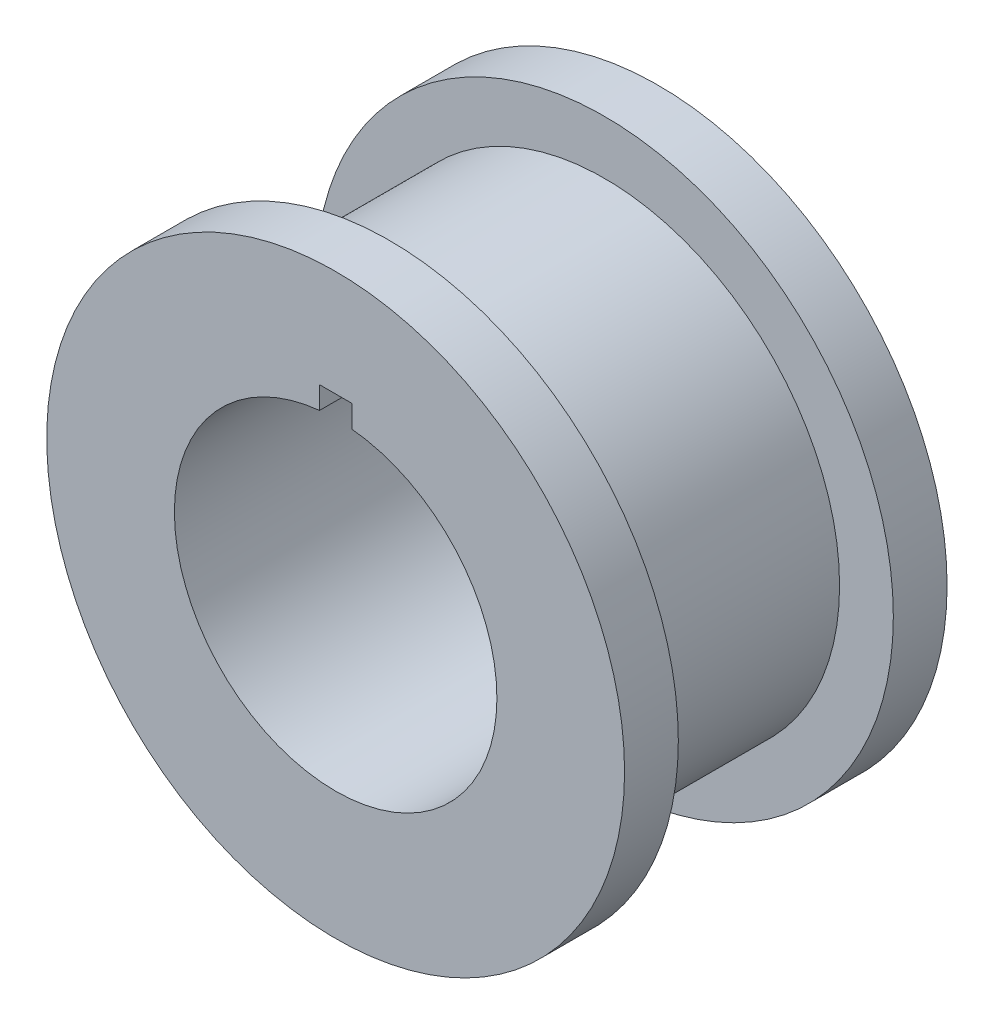
ISO-10303-21;
HEADER;
FILE_DESCRIPTION(('STEP AP214'),'2;1');
FILE_NAME('part.step','',(''),(''),'','','');
FILE_SCHEMA(('AUTOMOTIVE_DESIGN { 1 0 10303 214 1 1 1 1 }'));
ENDSEC;
DATA;
#1=APPLICATION_CONTEXT('core data for automotive mechanical design processes');
#2=APPLICATION_PROTOCOL_DEFINITION('international standard','automotive_design',2000,#1);
#3=PRODUCT_CONTEXT('',#1,'mechanical');
#4=PRODUCT('Part','Part','',(#3));
#5=PRODUCT_RELATED_PRODUCT_CATEGORY('part','',(#4));
#6=PRODUCT_DEFINITION_FORMATION('','',#4);
#7=PRODUCT_DEFINITION_CONTEXT('part definition',#1,'design');
#8=PRODUCT_DEFINITION('design','',#6,#7);
#9=PRODUCT_DEFINITION_SHAPE('','',#8);
#10=(LENGTH_UNIT() NAMED_UNIT(*) SI_UNIT(.MILLI.,.METRE.));
#11=(NAMED_UNIT(*) PLANE_ANGLE_UNIT() SI_UNIT($,.RADIAN.));
#12=(NAMED_UNIT(*) SI_UNIT($,.STERADIAN.) SOLID_ANGLE_UNIT());
#13=UNCERTAINTY_MEASURE_WITH_UNIT(LENGTH_MEASURE(1.E-05),#10,'distance_accuracy_value','');
#14=(GEOMETRIC_REPRESENTATION_CONTEXT(3) GLOBAL_UNCERTAINTY_ASSIGNED_CONTEXT((#13)) GLOBAL_UNIT_ASSIGNED_CONTEXT((#10,
#11,#12)) REPRESENTATION_CONTEXT('',''));
#15=CARTESIAN_POINT('',(0.,0.,0.));
#16=DIRECTION('',(0.,0.,1.));
#17=DIRECTION('',(1.,0.,0.));
#18=AXIS2_PLACEMENT_3D('',#15,#16,#17);
#19=CARTESIAN_POINT('',(0.,0.,15.));
#20=DIRECTION('',(0.,0.,-1.));
#21=DIRECTION('',(-1.,0.,0.));
#22=AXIS2_PLACEMENT_3D('',#19,#20,#21);
#23=CYLINDRICAL_SURFACE('',#22,21.875);
#24=CARTESIAN_POINT('',(0.,0.,10.));
#25=DIRECTION('',(0.,0.,1.));
#26=DIRECTION('',(1.,0.,0.));
#27=AXIS2_PLACEMENT_3D('',#24,#25,#26);
#28=CIRCLE('',#27,21.875);
#29=CARTESIAN_POINT('',(21.875,0.,10.));
#30=VERTEX_POINT('',#29);
#31=EDGE_CURVE('E50',#30,#30,#28,.T.);
#32=ORIENTED_EDGE('',*,*,#31,.F.);
#33=EDGE_LOOP('',(#32));
#34=FACE_BOUND('',#33,.T.);
#35=CARTESIAN_POINT('',(0.,0.,-10.));
#36=DIRECTION('',(0.,0.,-1.));
#37=DIRECTION('',(-1.,0.,0.));
#38=AXIS2_PLACEMENT_3D('',#35,#36,#37);
#39=CIRCLE('',#38,21.875);
#40=CARTESIAN_POINT('',(-21.875,0.,-10.));
#41=VERTEX_POINT('',#40);
#42=EDGE_CURVE('E11',#41,#41,#39,.T.);
#43=ORIENTED_EDGE('',*,*,#42,.F.);
#44=EDGE_LOOP('',(#43));
#45=FACE_BOUND('',#44,.T.);
#46=ADVANCED_FACE('F43',(#34,#45),#23,.T.);
#47=CARTESIAN_POINT('',(0.,0.,15.));
#48=DIRECTION('',(0.,0.,1.));
#49=DIRECTION('',(1.,0.,0.));
#50=AXIS2_PLACEMENT_3D('',#47,#48,#49);
#51=PLANE('',#50);
#52=CARTESIAN_POINT('',(0.,0.,15.));
#53=DIRECTION('',(0.,0.,1.));
#54=DIRECTION('',(1.,0.,0.));
#55=AXIS2_PLACEMENT_3D('',#52,#53,#54);
#56=CIRCLE('',#55,15.);
#57=CARTESIAN_POINT('',(-1.5,14.9248115565993,15.));
#58=VERTEX_POINT('',#57);
#59=CARTESIAN_POINT('',(1.49999999999999,14.9248115565993,15.));
#60=VERTEX_POINT('',#59);
#61=EDGE_CURVE('E85',#58,#60,#56,.T.);
#62=ORIENTED_EDGE('',*,*,#61,.F.);
#63=DIRECTION('',(0.,-1.,0.));
#64=VECTOR('',#63,1.);
#65=CARTESIAN_POINT('',(-1.5,0.,15.));
#66=LINE('',#65,#64);
#67=CARTESIAN_POINT('',(-1.5,17.,15.));
#68=VERTEX_POINT('',#67);
#69=EDGE_CURVE('E95',#68,#58,#66,.T.);
#70=ORIENTED_EDGE('',*,*,#69,.F.);
#71=DIRECTION('',(-1.,0.,0.));
#72=VECTOR('',#71,1.);
#73=CARTESIAN_POINT('',(-1.5,17.,15.));
#74=LINE('',#73,#72);
#75=CARTESIAN_POINT('',(1.49999999999999,17.,15.));
#76=VERTEX_POINT('',#75);
#77=EDGE_CURVE('E110',#76,#68,#74,.T.);
#78=ORIENTED_EDGE('',*,*,#77,.F.);
#79=DIRECTION('',(0.,1.,0.));
#80=VECTOR('',#79,1.);
#81=CARTESIAN_POINT('',(1.5,0.,15.));
#82=LINE('',#81,#80);
#83=EDGE_CURVE('E82',#60,#76,#82,.T.);
#84=ORIENTED_EDGE('',*,*,#83,.F.);
#85=EDGE_LOOP('',(#62,#70,#78,#84));
#86=FACE_BOUND('',#85,.T.);
#87=CARTESIAN_POINT('',(0.,0.,15.));
#88=DIRECTION('',(0.,0.,1.));
#89=DIRECTION('',(1.,0.,0.));
#90=AXIS2_PLACEMENT_3D('',#87,#88,#89);
#91=CIRCLE('',#90,26.875);
#92=CARTESIAN_POINT('',(26.875,0.,15.));
#93=VERTEX_POINT('',#92);
#94=EDGE_CURVE('E237',#93,#93,#91,.T.);
#95=ORIENTED_EDGE('',*,*,#94,.T.);
#96=EDGE_LOOP('',(#95));
#97=FACE_BOUND('',#96,.T.);
#98=ADVANCED_FACE('F126',(#86,#97),#51,.T.);
#99=CARTESIAN_POINT('',(0.,0.,-15.));
#100=DIRECTION('',(0.,0.,1.));
#101=DIRECTION('',(1.,0.,0.));
#102=AXIS2_PLACEMENT_3D('',#99,#100,#101);
#103=PLANE('',#102);
#104=DIRECTION('',(0.,-1.,0.));
#105=VECTOR('',#104,1.);
#106=CARTESIAN_POINT('',(-1.5,0.,-15.));
#107=LINE('',#106,#105);
#108=CARTESIAN_POINT('',(-1.5,17.,-15.));
#109=VERTEX_POINT('',#108);
#110=CARTESIAN_POINT('',(-1.5,14.9248115565993,-15.));
#111=VERTEX_POINT('',#110);
#112=EDGE_CURVE('E102',#109,#111,#107,.T.);
#113=ORIENTED_EDGE('',*,*,#112,.T.);
#114=CARTESIAN_POINT('',(0.,0.,-15.));
#115=DIRECTION('',(0.,0.,1.));
#116=DIRECTION('',(1.,0.,0.));
#117=AXIS2_PLACEMENT_3D('',#114,#115,#116);
#118=CIRCLE('',#117,15.);
#119=CARTESIAN_POINT('',(1.49999999999999,14.9248115565993,-15.));
#120=VERTEX_POINT('',#119);
#121=EDGE_CURVE('E101',#111,#120,#118,.T.);
#122=ORIENTED_EDGE('',*,*,#121,.T.);
#123=DIRECTION('',(0.,1.,0.));
#124=VECTOR('',#123,1.);
#125=CARTESIAN_POINT('',(1.5,0.,-15.));
#126=LINE('',#125,#124);
#127=CARTESIAN_POINT('',(1.49999999999999,17.,-15.));
#128=VERTEX_POINT('',#127);
#129=EDGE_CURVE('E57',#120,#128,#126,.T.);
#130=ORIENTED_EDGE('',*,*,#129,.T.);
#131=DIRECTION('',(-1.,0.,0.));
#132=VECTOR('',#131,1.);
#133=CARTESIAN_POINT('',(-1.5,17.,-15.));
#134=LINE('',#133,#132);
#135=EDGE_CURVE('E89',#128,#109,#134,.T.);
#136=ORIENTED_EDGE('',*,*,#135,.T.);
#137=EDGE_LOOP('',(#113,#122,#130,#136));
#138=FACE_BOUND('',#137,.T.);
#139=CARTESIAN_POINT('',(0.,0.,-15.));
#140=DIRECTION('',(0.,0.,1.));
#141=DIRECTION('',(1.,0.,0.));
#142=AXIS2_PLACEMENT_3D('',#139,#140,#141);
#143=CIRCLE('',#142,26.875);
#144=CARTESIAN_POINT('',(26.875,0.,-15.));
#145=VERTEX_POINT('',#144);
#146=EDGE_CURVE('E242',#145,#145,#143,.T.);
#147=ORIENTED_EDGE('',*,*,#146,.F.);
#148=EDGE_LOOP('',(#147));
#149=FACE_BOUND('',#148,.T.);
#150=ADVANCED_FACE('F98',(#138,#149),#103,.F.);
#151=CARTESIAN_POINT('',(0.,0.,-15.));
#152=DIRECTION('',(0.,0.,1.));
#153=DIRECTION('',(1.,0.,0.));
#154=AXIS2_PLACEMENT_3D('',#151,#152,#153);
#155=CYLINDRICAL_SURFACE('',#154,15.);
#156=DIRECTION('',(0.,0.,1.));
#157=VECTOR('',#156,1.);
#158=CARTESIAN_POINT('',(-1.5,14.9248115565993,-15.));
#159=LINE('',#158,#157);
#160=EDGE_CURVE('E117',#58,#111,#159,.F.);
#161=ORIENTED_EDGE('',*,*,#160,.F.);
#162=ORIENTED_EDGE('',*,*,#61,.T.);
#163=DIRECTION('',(0.,0.,1.));
#164=VECTOR('',#163,1.);
#165=CARTESIAN_POINT('',(1.49999999999999,14.9248115565993,-15.));
#166=LINE('',#165,#164);
#167=EDGE_CURVE('E61',#120,#60,#166,.T.);
#168=ORIENTED_EDGE('',*,*,#167,.F.);
#169=ORIENTED_EDGE('',*,*,#121,.F.);
#170=EDGE_LOOP('',(#161,#162,#168,#169));
#171=FACE_BOUND('',#170,.T.);
#172=ADVANCED_FACE('F155',(#171),#155,.F.);
#173=CARTESIAN_POINT('',(-1.5,0.,15.));
#174=DIRECTION('',(1.,0.,0.));
#175=DIRECTION('',(0.,0.,-1.));
#176=AXIS2_PLACEMENT_3D('',#173,#174,#175);
#177=PLANE('',#176);
#178=ORIENTED_EDGE('',*,*,#160,.T.);
#179=ORIENTED_EDGE('',*,*,#112,.F.);
#180=DIRECTION('',(0.,0.,-1.));
#181=VECTOR('',#180,1.);
#182=CARTESIAN_POINT('',(-1.5,17.,15.));
#183=LINE('',#182,#181);
#184=EDGE_CURVE('E86',#68,#109,#183,.T.);
#185=ORIENTED_EDGE('',*,*,#184,.F.);
#186=ORIENTED_EDGE('',*,*,#69,.T.);
#187=EDGE_LOOP('',(#178,#179,#185,#186));
#188=FACE_BOUND('',#187,.T.);
#189=ADVANCED_FACE('F152',(#188),#177,.T.);
#190=CARTESIAN_POINT('',(1.5,0.,15.));
#191=DIRECTION('',(-1.,0.,0.));
#192=DIRECTION('',(0.,-1.,0.));
#193=AXIS2_PLACEMENT_3D('',#190,#191,#192);
#194=PLANE('',#193);
#195=ORIENTED_EDGE('',*,*,#167,.T.);
#196=ORIENTED_EDGE('',*,*,#83,.T.);
#197=DIRECTION('',(0.,0.,-1.));
#198=VECTOR('',#197,1.);
#199=CARTESIAN_POINT('',(1.49999999999999,17.,15.));
#200=LINE('',#199,#198);
#201=EDGE_CURVE('E79',#76,#128,#200,.T.);
#202=ORIENTED_EDGE('',*,*,#201,.T.);
#203=ORIENTED_EDGE('',*,*,#129,.F.);
#204=EDGE_LOOP('',(#195,#196,#202,#203));
#205=FACE_BOUND('',#204,.T.);
#206=ADVANCED_FACE('F81',(#205),#194,.T.);
#207=CARTESIAN_POINT('',(-1.5,17.,15.));
#208=DIRECTION('',(0.,-1.,0.));
#209=DIRECTION('',(0.,0.,-1.));
#210=AXIS2_PLACEMENT_3D('',#207,#208,#209);
#211=PLANE('',#210);
#212=ORIENTED_EDGE('',*,*,#201,.F.);
#213=ORIENTED_EDGE('',*,*,#77,.T.);
#214=ORIENTED_EDGE('',*,*,#184,.T.);
#215=ORIENTED_EDGE('',*,*,#135,.F.);
#216=EDGE_LOOP('',(#212,#213,#214,#215));
#217=FACE_BOUND('',#216,.T.);
#218=ADVANCED_FACE('F90',(#217),#211,.T.);
#219=CARTESIAN_POINT('',(0.,0.,10.));
#220=DIRECTION('',(0.,0.,1.));
#221=DIRECTION('',(1.,0.,0.));
#222=AXIS2_PLACEMENT_3D('',#219,#220,#221);
#223=CYLINDRICAL_SURFACE('',#222,26.875);
#224=CARTESIAN_POINT('',(0.,0.,10.));
#225=DIRECTION('',(0.,0.,1.));
#226=DIRECTION('',(1.,0.,0.));
#227=AXIS2_PLACEMENT_3D('',#224,#225,#226);
#228=CIRCLE('',#227,26.875);
#229=CARTESIAN_POINT('',(26.875,0.,10.));
#230=VERTEX_POINT('',#229);
#231=EDGE_CURVE('E104',#230,#230,#228,.T.);
#232=ORIENTED_EDGE('',*,*,#231,.T.);
#233=EDGE_LOOP('',(#232));
#234=FACE_BOUND('',#233,.T.);
#235=ORIENTED_EDGE('',*,*,#94,.F.);
#236=EDGE_LOOP('',(#235));
#237=FACE_BOUND('',#236,.T.);
#238=ADVANCED_FACE('F141',(#234,#237),#223,.T.);
#239=CARTESIAN_POINT('',(0.,0.,10.));
#240=DIRECTION('',(0.,0.,1.));
#241=DIRECTION('',(1.,0.,0.));
#242=AXIS2_PLACEMENT_3D('',#239,#240,#241);
#243=PLANE('',#242);
#244=ORIENTED_EDGE('',*,*,#31,.T.);
#245=EDGE_LOOP('',(#244));
#246=FACE_BOUND('',#245,.T.);
#247=ORIENTED_EDGE('',*,*,#231,.F.);
#248=EDGE_LOOP('',(#247));
#249=FACE_BOUND('',#248,.T.);
#250=ADVANCED_FACE('F121',(#246,#249),#243,.F.);
#251=CARTESIAN_POINT('',(0.,0.,-10.));
#252=DIRECTION('',(0.,0.,-1.));
#253=DIRECTION('',(1.,0.,0.));
#254=AXIS2_PLACEMENT_3D('',#251,#252,#253);
#255=PLANE('',#254);
#256=CARTESIAN_POINT('',(0.,0.,-10.));
#257=DIRECTION('',(0.,0.,1.));
#258=DIRECTION('',(1.,0.,0.));
#259=AXIS2_PLACEMENT_3D('',#256,#257,#258);
#260=CIRCLE('',#259,26.875);
#261=CARTESIAN_POINT('',(26.875,0.,-10.));
#262=VERTEX_POINT('',#261);
#263=EDGE_CURVE('E239',#262,#262,#260,.T.);
#264=ORIENTED_EDGE('',*,*,#263,.T.);
#265=EDGE_LOOP('',(#264));
#266=FACE_BOUND('',#265,.T.);
#267=ORIENTED_EDGE('',*,*,#42,.T.);
#268=EDGE_LOOP('',(#267));
#269=FACE_BOUND('',#268,.T.);
#270=ADVANCED_FACE('F129',(#266,#269),#255,.F.);
#271=CARTESIAN_POINT('',(0.,0.,-10.));
#272=DIRECTION('',(0.,0.,-1.));
#273=DIRECTION('',(-1.,0.,0.));
#274=AXIS2_PLACEMENT_3D('',#271,#272,#273);
#275=CYLINDRICAL_SURFACE('',#274,26.875);
#276=ORIENTED_EDGE('',*,*,#263,.F.);
#277=EDGE_LOOP('',(#276));
#278=FACE_BOUND('',#277,.T.);
#279=ORIENTED_EDGE('',*,*,#146,.T.);
#280=EDGE_LOOP('',(#279));
#281=FACE_BOUND('',#280,.T.);
#282=ADVANCED_FACE('F131',(#278,#281),#275,.T.);
#283=CLOSED_SHELL('',(#46,#98,#150,#172,#189,#206,#218,#238,#250,#270,#282));
#284=MANIFOLD_SOLID_BREP('B2',#283);
#285=ADVANCED_BREP_SHAPE_REPRESENTATION('',(#18,#284),#14);
#286=SHAPE_DEFINITION_REPRESENTATION(#9,#285);
ENDSEC;
END-ISO-10303-21;
